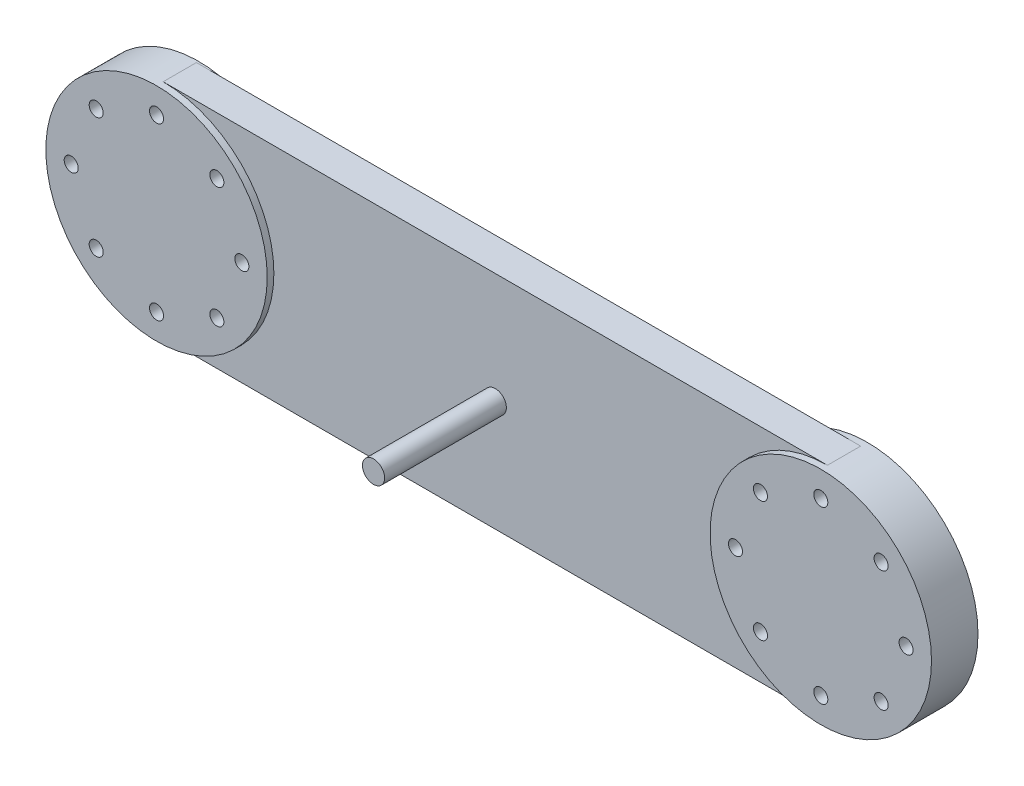
ISO-10303-21;
HEADER;
FILE_DESCRIPTION(('STEP AP214'),'2;1');
FILE_NAME('part.step','',(''),(''),'','','');
FILE_SCHEMA(('AUTOMOTIVE_DESIGN { 1 0 10303 214 1 1 1 1 }'));
ENDSEC;
DATA;
#1=APPLICATION_CONTEXT('core data for automotive mechanical design processes');
#2=APPLICATION_PROTOCOL_DEFINITION('international standard','automotive_design',2000,#1);
#3=PRODUCT_CONTEXT('',#1,'mechanical');
#4=PRODUCT('Part','Part','',(#3));
#5=PRODUCT_RELATED_PRODUCT_CATEGORY('part','',(#4));
#6=PRODUCT_DEFINITION_FORMATION('','',#4);
#7=PRODUCT_DEFINITION_CONTEXT('part definition',#1,'design');
#8=PRODUCT_DEFINITION('design','',#6,#7);
#9=PRODUCT_DEFINITION_SHAPE('','',#8);
#10=(LENGTH_UNIT() NAMED_UNIT(*) SI_UNIT(.MILLI.,.METRE.));
#11=(NAMED_UNIT(*) PLANE_ANGLE_UNIT() SI_UNIT($,.RADIAN.));
#12=(NAMED_UNIT(*) SI_UNIT($,.STERADIAN.) SOLID_ANGLE_UNIT());
#13=UNCERTAINTY_MEASURE_WITH_UNIT(LENGTH_MEASURE(1.E-05),#10,'distance_accuracy_value','');
#14=(GEOMETRIC_REPRESENTATION_CONTEXT(3) GLOBAL_UNCERTAINTY_ASSIGNED_CONTEXT((#13)) GLOBAL_UNIT_ASSIGNED_CONTEXT((#10,
#11,#12)) REPRESENTATION_CONTEXT('',''));
#15=CARTESIAN_POINT('',(0.,0.,0.));
#16=DIRECTION('',(0.,0.,1.));
#17=DIRECTION('',(1.,0.,0.));
#18=AXIS2_PLACEMENT_3D('',#15,#16,#17);
#19=CARTESIAN_POINT('',(-300.,50.,0.));
#20=DIRECTION('',(0.,0.,1.));
#21=DIRECTION('',(1.,0.,0.));
#22=AXIS2_PLACEMENT_3D('',#19,#20,#21);
#23=PLANE('',#22);
#24=CARTESIAN_POINT('',(0.,50.,0.));
#25=DIRECTION('',(0.,0.,1.));
#26=DIRECTION('',(1.,0.,0.));
#27=AXIS2_PLACEMENT_3D('',#24,#25,#26);
#28=CIRCLE('',#27,50.);
#29=CARTESIAN_POINT('',(0.,100.,0.));
#30=VERTEX_POINT('',#29);
#31=CARTESIAN_POINT('',(0.,0.,0.));
#32=VERTEX_POINT('',#31);
#33=EDGE_CURVE('E138',#30,#32,#28,.T.);
#34=ORIENTED_EDGE('',*,*,#33,.T.);
#35=DIRECTION('',(-1.,0.,0.));
#36=VECTOR('',#35,1.);
#37=CARTESIAN_POINT('',(0.,0.,0.));
#38=LINE('',#37,#36);
#39=CARTESIAN_POINT('',(-300.,0.,0.));
#40=VERTEX_POINT('',#39);
#41=EDGE_CURVE('E146',#32,#40,#38,.T.);
#42=ORIENTED_EDGE('',*,*,#41,.T.);
#43=CARTESIAN_POINT('',(-300.,50.,0.));
#44=DIRECTION('',(0.,0.,1.));
#45=DIRECTION('',(1.,0.,0.));
#46=AXIS2_PLACEMENT_3D('',#43,#44,#45);
#47=CIRCLE('',#46,50.);
#48=CARTESIAN_POINT('',(-300.,100.,0.));
#49=VERTEX_POINT('',#48);
#50=EDGE_CURVE('E285',#40,#49,#47,.T.);
#51=ORIENTED_EDGE('',*,*,#50,.T.);
#52=DIRECTION('',(-1.,0.,0.));
#53=VECTOR('',#52,1.);
#54=CARTESIAN_POINT('',(0.,100.,0.));
#55=LINE('',#54,#53);
#56=EDGE_CURVE('E157',#30,#49,#55,.T.);
#57=ORIENTED_EDGE('',*,*,#56,.F.);
#58=EDGE_LOOP('',(#34,#42,#51,#57));
#59=FACE_BOUND('',#58,.T.);
#60=ADVANCED_FACE('F89',(#59),#23,.F.);
#61=CARTESIAN_POINT('',(0.,100.,15.));
#62=DIRECTION('',(0.,-1.,0.));
#63=DIRECTION('',(1.,0.,0.));
#64=AXIS2_PLACEMENT_3D('',#61,#62,#63);
#65=PLANE('',#64);
#66=ORIENTED_EDGE('',*,*,#56,.T.);
#67=DIRECTION('',(0.,0.,-1.));
#68=VECTOR('',#67,1.);
#69=CARTESIAN_POINT('',(-300.,100.,15.));
#70=LINE('',#69,#68);
#71=CARTESIAN_POINT('',(-300.,100.,15.));
#72=VERTEX_POINT('',#71);
#73=EDGE_CURVE('E166',#72,#49,#70,.T.);
#74=ORIENTED_EDGE('',*,*,#73,.F.);
#75=DIRECTION('',(-1.,0.,0.));
#76=VECTOR('',#75,1.);
#77=CARTESIAN_POINT('',(0.,100.,15.));
#78=LINE('',#77,#76);
#79=CARTESIAN_POINT('',(0.,100.,15.));
#80=VERTEX_POINT('',#79);
#81=EDGE_CURVE('E151',#80,#72,#78,.T.);
#82=ORIENTED_EDGE('',*,*,#81,.F.);
#83=DIRECTION('',(0.,0.,-1.));
#84=VECTOR('',#83,1.);
#85=CARTESIAN_POINT('',(0.,100.,15.));
#86=LINE('',#85,#84);
#87=EDGE_CURVE('E98',#80,#30,#86,.T.);
#88=ORIENTED_EDGE('',*,*,#87,.T.);
#89=EDGE_LOOP('',(#66,#74,#82,#88));
#90=FACE_BOUND('',#89,.T.);
#91=ADVANCED_FACE('F308',(#90),#65,.F.);
#92=CARTESIAN_POINT('',(0.,0.,15.));
#93=DIRECTION('',(0.,-1.,0.));
#94=DIRECTION('',(1.,0.,0.));
#95=AXIS2_PLACEMENT_3D('',#92,#93,#94);
#96=PLANE('',#95);
#97=ORIENTED_EDGE('',*,*,#41,.F.);
#98=DIRECTION('',(0.,0.,-1.));
#99=VECTOR('',#98,1.);
#100=CARTESIAN_POINT('',(0.,0.,15.));
#101=LINE('',#100,#99);
#102=CARTESIAN_POINT('',(0.,0.,15.));
#103=VERTEX_POINT('',#102);
#104=EDGE_CURVE('E130',#103,#32,#101,.T.);
#105=ORIENTED_EDGE('',*,*,#104,.F.);
#106=DIRECTION('',(-1.,0.,0.));
#107=VECTOR('',#106,1.);
#108=CARTESIAN_POINT('',(0.,0.,15.));
#109=LINE('',#108,#107);
#110=CARTESIAN_POINT('',(-300.,0.,15.));
#111=VERTEX_POINT('',#110);
#112=EDGE_CURVE('E144',#103,#111,#109,.T.);
#113=ORIENTED_EDGE('',*,*,#112,.T.);
#114=DIRECTION('',(0.,0.,-1.));
#115=VECTOR('',#114,1.);
#116=CARTESIAN_POINT('',(-300.,0.,15.));
#117=LINE('',#116,#115);
#118=EDGE_CURVE('E106',#111,#40,#117,.T.);
#119=ORIENTED_EDGE('',*,*,#118,.T.);
#120=EDGE_LOOP('',(#97,#105,#113,#119));
#121=FACE_BOUND('',#120,.T.);
#122=ADVANCED_FACE('F143',(#121),#96,.T.);
#123=CARTESIAN_POINT('',(0.,0.,15.));
#124=DIRECTION('',(0.,0.,1.));
#125=DIRECTION('',(1.,0.,0.));
#126=AXIS2_PLACEMENT_3D('',#123,#124,#125);
#127=PLANE('',#126);
#128=CARTESIAN_POINT('',(-150.,49.9999999999999,15.));
#129=DIRECTION('',(0.,0.,1.));
#130=DIRECTION('',(1.,0.,0.));
#131=AXIS2_PLACEMENT_3D('',#128,#129,#130);
#132=CIRCLE('',#131,4.99999999999999);
#133=CARTESIAN_POINT('',(-145.,49.9999999999999,15.));
#134=VERTEX_POINT('',#133);
#135=EDGE_CURVE('E161',#134,#134,#132,.F.);
#136=ORIENTED_EDGE('',*,*,#135,.T.);
#137=EDGE_LOOP('',(#136));
#138=FACE_BOUND('',#137,.T.);
#139=ORIENTED_EDGE('',*,*,#112,.F.);
#140=CARTESIAN_POINT('',(0.,50.,15.));
#141=DIRECTION('',(0.,0.,1.));
#142=DIRECTION('',(1.,0.,0.));
#143=AXIS2_PLACEMENT_3D('',#140,#141,#142);
#144=CIRCLE('',#143,50.);
#145=EDGE_CURVE('E127',#103,#80,#144,.F.);
#146=ORIENTED_EDGE('',*,*,#145,.T.);
#147=ORIENTED_EDGE('',*,*,#81,.T.);
#148=CARTESIAN_POINT('',(-300.,50.,15.));
#149=DIRECTION('',(0.,0.,1.));
#150=DIRECTION('',(1.,0.,0.));
#151=AXIS2_PLACEMENT_3D('',#148,#149,#150);
#152=CIRCLE('',#151,50.);
#153=EDGE_CURVE('E12',#72,#111,#152,.F.);
#154=ORIENTED_EDGE('',*,*,#153,.T.);
#155=EDGE_LOOP('',(#139,#146,#147,#154));
#156=FACE_BOUND('',#155,.T.);
#157=ADVANCED_FACE('F149',(#138,#156),#127,.T.);
#158=CARTESIAN_POINT('',(-150.,49.9999999999999,70.));
#159=DIRECTION('',(0.,0.,-1.));
#160=DIRECTION('',(-1.,0.,0.));
#161=AXIS2_PLACEMENT_3D('',#158,#159,#160);
#162=CYLINDRICAL_SURFACE('',#161,4.99999999999999);
#163=ORIENTED_EDGE('',*,*,#135,.F.);
#164=EDGE_LOOP('',(#163));
#165=FACE_BOUND('',#164,.T.);
#166=CARTESIAN_POINT('',(-150.,49.9999999999999,70.));
#167=DIRECTION('',(0.,0.,1.));
#168=DIRECTION('',(1.,0.,0.));
#169=AXIS2_PLACEMENT_3D('',#166,#167,#168);
#170=CIRCLE('',#169,4.99999999999999);
#171=CARTESIAN_POINT('',(-145.,49.9999999999999,70.));
#172=VERTEX_POINT('',#171);
#173=EDGE_CURVE('E173',#172,#172,#170,.T.);
#174=ORIENTED_EDGE('',*,*,#173,.F.);
#175=EDGE_LOOP('',(#174));
#176=FACE_BOUND('',#175,.T.);
#177=ADVANCED_FACE('F294',(#165,#176),#162,.T.);
#178=CARTESIAN_POINT('',(-150.,49.9999999999999,70.));
#179=DIRECTION('',(0.,0.,1.));
#180=DIRECTION('',(1.,0.,0.));
#181=AXIS2_PLACEMENT_3D('',#178,#179,#180);
#182=PLANE('',#181);
#183=ORIENTED_EDGE('',*,*,#173,.T.);
#184=EDGE_LOOP('',(#183));
#185=FACE_BOUND('',#184,.T.);
#186=ADVANCED_FACE('F292',(#185),#182,.T.);
#187=CARTESIAN_POINT('',(-300.,50.,-0.999999999999997));
#188=DIRECTION('',(0.,0.,1.));
#189=DIRECTION('',(1.,0.,0.));
#190=AXIS2_PLACEMENT_3D('',#187,#188,#189);
#191=CYLINDRICAL_SURFACE('',#190,50.);
#192=CARTESIAN_POINT('',(-300.,50.,18.));
#193=DIRECTION('',(0.,0.,1.));
#194=DIRECTION('',(1.,0.,0.));
#195=AXIS2_PLACEMENT_3D('',#192,#193,#194);
#196=CIRCLE('',#195,50.);
#197=CARTESIAN_POINT('',(-250.,50.,18.));
#198=VERTEX_POINT('',#197);
#199=EDGE_CURVE('E277',#198,#198,#196,.T.);
#200=ORIENTED_EDGE('',*,*,#199,.F.);
#201=EDGE_LOOP('',(#200));
#202=FACE_BOUND('',#201,.T.);
#203=CARTESIAN_POINT('',(-300.,50.,-0.999999999999997));
#204=DIRECTION('',(0.,0.,1.));
#205=DIRECTION('',(1.,0.,0.));
#206=AXIS2_PLACEMENT_3D('',#203,#204,#205);
#207=CIRCLE('',#206,50.);
#208=CARTESIAN_POINT('',(-250.,50.,-0.999999999999997));
#209=VERTEX_POINT('',#208);
#210=EDGE_CURVE('E281',#209,#209,#207,.T.);
#211=ORIENTED_EDGE('',*,*,#210,.T.);
#212=EDGE_LOOP('',(#211));
#213=FACE_BOUND('',#212,.T.);
#214=ORIENTED_EDGE('',*,*,#50,.F.);
#215=ORIENTED_EDGE('',*,*,#118,.F.);
#216=ORIENTED_EDGE('',*,*,#153,.F.);
#217=ORIENTED_EDGE('',*,*,#73,.T.);
#218=EDGE_LOOP('',(#214,#215,#216,#217));
#219=FACE_BOUND('',#218,.T.);
#220=ADVANCED_FACE('F302',(#202,#213,#219),#191,.T.);
#221=CARTESIAN_POINT('',(-300.,50.,-0.999999999999997));
#222=DIRECTION('',(0.,0.,1.));
#223=DIRECTION('',(1.,0.,0.));
#224=AXIS2_PLACEMENT_3D('',#221,#222,#223);
#225=PLANE('',#224);
#226=CARTESIAN_POINT('',(-272.754935969733,22.7549359697327,-1.));
#227=DIRECTION('',(0.,0.,1.));
#228=DIRECTION('',(1.,0.,0.));
#229=AXIS2_PLACEMENT_3D('',#226,#227,#228);
#230=CIRCLE('',#229,3.17499999999995);
#231=CARTESIAN_POINT('',(-269.579935969733,22.7549359697327,-1.));
#232=VERTEX_POINT('',#231);
#233=EDGE_CURVE('E260',#232,#232,#230,.T.);
#234=ORIENTED_EDGE('',*,*,#233,.T.);
#235=EDGE_LOOP('',(#234));
#236=FACE_BOUND('',#235,.T.);
#237=CARTESIAN_POINT('',(-300.,11.4696609406727,-1.));
#238=DIRECTION('',(0.,0.,1.));
#239=DIRECTION('',(1.,0.,0.));
#240=AXIS2_PLACEMENT_3D('',#237,#238,#239);
#241=CIRCLE('',#240,3.17499999999997);
#242=CARTESIAN_POINT('',(-296.825,11.4696609406727,-1.));
#243=VERTEX_POINT('',#242);
#244=EDGE_CURVE('E246',#243,#243,#241,.T.);
#245=ORIENTED_EDGE('',*,*,#244,.T.);
#246=EDGE_LOOP('',(#245));
#247=FACE_BOUND('',#246,.T.);
#248=CARTESIAN_POINT('',(-327.245064030267,22.7549359697329,-1.));
#249=DIRECTION('',(0.,0.,1.));
#250=DIRECTION('',(1.,0.,0.));
#251=AXIS2_PLACEMENT_3D('',#248,#249,#250);
#252=CIRCLE('',#251,3.17499999999995);
#253=CARTESIAN_POINT('',(-324.070064030267,22.7549359697329,-1.));
#254=VERTEX_POINT('',#253);
#255=EDGE_CURVE('E242',#254,#254,#252,.T.);
#256=ORIENTED_EDGE('',*,*,#255,.T.);
#257=EDGE_LOOP('',(#256));
#258=FACE_BOUND('',#257,.T.);
#259=CARTESIAN_POINT('',(-338.530339059327,50.0000000000003,-1.));
#260=DIRECTION('',(0.,0.,1.));
#261=DIRECTION('',(1.,0.,0.));
#262=AXIS2_PLACEMENT_3D('',#259,#260,#261);
#263=CIRCLE('',#262,3.17499999999996);
#264=CARTESIAN_POINT('',(-335.355339059327,50.0000000000003,-1.));
#265=VERTEX_POINT('',#264);
#266=EDGE_CURVE('E238',#265,#265,#263,.T.);
#267=ORIENTED_EDGE('',*,*,#266,.T.);
#268=EDGE_LOOP('',(#267));
#269=FACE_BOUND('',#268,.T.);
#270=CARTESIAN_POINT('',(-327.245064030267,77.2450640302675,-1.));
#271=DIRECTION('',(0.,0.,1.));
#272=DIRECTION('',(1.,0.,0.));
#273=AXIS2_PLACEMENT_3D('',#270,#271,#272);
#274=CIRCLE('',#273,3.17499999999997);
#275=CARTESIAN_POINT('',(-324.070064030267,77.2450640302675,-1.));
#276=VERTEX_POINT('',#275);
#277=EDGE_CURVE('E233',#276,#276,#274,.T.);
#278=ORIENTED_EDGE('',*,*,#277,.T.);
#279=EDGE_LOOP('',(#278));
#280=FACE_BOUND('',#279,.T.);
#281=CARTESIAN_POINT('',(-300.,88.5303390593272,-1.));
#282=DIRECTION('',(0.,0.,1.));
#283=DIRECTION('',(1.,0.,0.));
#284=AXIS2_PLACEMENT_3D('',#281,#282,#283);
#285=CIRCLE('',#284,3.17500000000002);
#286=CARTESIAN_POINT('',(-296.825,88.5303390593272,-1.));
#287=VERTEX_POINT('',#286);
#288=EDGE_CURVE('E228',#287,#287,#285,.T.);
#289=ORIENTED_EDGE('',*,*,#288,.T.);
#290=EDGE_LOOP('',(#289));
#291=FACE_BOUND('',#290,.T.);
#292=CARTESIAN_POINT('',(-272.754935969732,77.2450640302669,-1.));
#293=DIRECTION('',(0.,0.,1.));
#294=DIRECTION('',(1.,0.,0.));
#295=AXIS2_PLACEMENT_3D('',#292,#293,#294);
#296=CIRCLE('',#295,3.17499999999998);
#297=CARTESIAN_POINT('',(-269.579935969732,77.2450640302669,-1.));
#298=VERTEX_POINT('',#297);
#299=EDGE_CURVE('E223',#298,#298,#296,.T.);
#300=ORIENTED_EDGE('',*,*,#299,.T.);
#301=EDGE_LOOP('',(#300));
#302=FACE_BOUND('',#301,.T.);
#303=CARTESIAN_POINT('',(-261.469660940673,50.,-1.));
#304=DIRECTION('',(0.,0.,1.));
#305=DIRECTION('',(1.,0.,0.));
#306=AXIS2_PLACEMENT_3D('',#303,#304,#305);
#307=CIRCLE('',#306,3.17499999999997);
#308=CARTESIAN_POINT('',(-258.294660940673,50.,-1.));
#309=VERTEX_POINT('',#308);
#310=EDGE_CURVE('E178',#309,#309,#307,.F.);
#311=ORIENTED_EDGE('',*,*,#310,.F.);
#312=EDGE_LOOP('',(#311));
#313=FACE_BOUND('',#312,.T.);
#314=ORIENTED_EDGE('',*,*,#210,.F.);
#315=EDGE_LOOP('',(#314));
#316=FACE_BOUND('',#315,.T.);
#317=ADVANCED_FACE('F317',(#236,#247,#258,#269,#280,#291,#302,#313,#316),#225,.F.);
#318=CARTESIAN_POINT('',(-300.,50.,18.));
#319=DIRECTION('',(0.,0.,1.));
#320=DIRECTION('',(1.,0.,0.));
#321=AXIS2_PLACEMENT_3D('',#318,#319,#320);
#322=PLANE('',#321);
#323=CARTESIAN_POINT('',(-272.754935969733,22.7549359697327,18.));
#324=DIRECTION('',(0.,0.,1.));
#325=DIRECTION('',(1.,0.,0.));
#326=AXIS2_PLACEMENT_3D('',#323,#324,#325);
#327=CIRCLE('',#326,3.17499999999995);
#328=CARTESIAN_POINT('',(-269.579935969733,22.7549359697327,18.));
#329=VERTEX_POINT('',#328);
#330=EDGE_CURVE('E92',#329,#329,#327,.T.);
#331=ORIENTED_EDGE('',*,*,#330,.F.);
#332=EDGE_LOOP('',(#331));
#333=FACE_BOUND('',#332,.T.);
#334=CARTESIAN_POINT('',(-300.,11.4696609406727,18.));
#335=DIRECTION('',(0.,0.,1.));
#336=DIRECTION('',(1.,0.,0.));
#337=AXIS2_PLACEMENT_3D('',#334,#335,#336);
#338=CIRCLE('',#337,3.17499999999997);
#339=CARTESIAN_POINT('',(-296.825,11.4696609406727,18.));
#340=VERTEX_POINT('',#339);
#341=EDGE_CURVE('E243',#340,#340,#338,.T.);
#342=ORIENTED_EDGE('',*,*,#341,.F.);
#343=EDGE_LOOP('',(#342));
#344=FACE_BOUND('',#343,.T.);
#345=CARTESIAN_POINT('',(-327.245064030267,22.7549359697329,18.));
#346=DIRECTION('',(0.,0.,1.));
#347=DIRECTION('',(1.,0.,0.));
#348=AXIS2_PLACEMENT_3D('',#345,#346,#347);
#349=CIRCLE('',#348,3.17499999999995);
#350=CARTESIAN_POINT('',(-324.070064030267,22.7549359697329,18.));
#351=VERTEX_POINT('',#350);
#352=EDGE_CURVE('E239',#351,#351,#349,.T.);
#353=ORIENTED_EDGE('',*,*,#352,.F.);
#354=EDGE_LOOP('',(#353));
#355=FACE_BOUND('',#354,.T.);
#356=CARTESIAN_POINT('',(-338.530339059327,50.0000000000003,18.));
#357=DIRECTION('',(0.,0.,1.));
#358=DIRECTION('',(1.,0.,0.));
#359=AXIS2_PLACEMENT_3D('',#356,#357,#358);
#360=CIRCLE('',#359,3.17499999999996);
#361=CARTESIAN_POINT('',(-335.355339059327,50.0000000000003,18.));
#362=VERTEX_POINT('',#361);
#363=EDGE_CURVE('E234',#362,#362,#360,.T.);
#364=ORIENTED_EDGE('',*,*,#363,.F.);
#365=EDGE_LOOP('',(#364));
#366=FACE_BOUND('',#365,.T.);
#367=CARTESIAN_POINT('',(-327.245064030267,77.2450640302675,18.));
#368=DIRECTION('',(0.,0.,1.));
#369=DIRECTION('',(1.,0.,0.));
#370=AXIS2_PLACEMENT_3D('',#367,#368,#369);
#371=CIRCLE('',#370,3.17499999999997);
#372=CARTESIAN_POINT('',(-324.070064030267,77.2450640302675,18.));
#373=VERTEX_POINT('',#372);
#374=EDGE_CURVE('E229',#373,#373,#371,.T.);
#375=ORIENTED_EDGE('',*,*,#374,.F.);
#376=EDGE_LOOP('',(#375));
#377=FACE_BOUND('',#376,.T.);
#378=CARTESIAN_POINT('',(-300.,88.5303390593272,18.));
#379=DIRECTION('',(0.,0.,1.));
#380=DIRECTION('',(1.,0.,0.));
#381=AXIS2_PLACEMENT_3D('',#378,#379,#380);
#382=CIRCLE('',#381,3.17500000000002);
#383=CARTESIAN_POINT('',(-296.825,88.5303390593272,18.));
#384=VERTEX_POINT('',#383);
#385=EDGE_CURVE('E224',#384,#384,#382,.T.);
#386=ORIENTED_EDGE('',*,*,#385,.F.);
#387=EDGE_LOOP('',(#386));
#388=FACE_BOUND('',#387,.T.);
#389=CARTESIAN_POINT('',(-272.754935969732,77.2450640302669,18.));
#390=DIRECTION('',(0.,0.,1.));
#391=DIRECTION('',(1.,0.,0.));
#392=AXIS2_PLACEMENT_3D('',#389,#390,#391);
#393=CIRCLE('',#392,3.17499999999998);
#394=CARTESIAN_POINT('',(-269.579935969732,77.2450640302669,18.));
#395=VERTEX_POINT('',#394);
#396=EDGE_CURVE('E219',#395,#395,#393,.T.);
#397=ORIENTED_EDGE('',*,*,#396,.F.);
#398=EDGE_LOOP('',(#397));
#399=FACE_BOUND('',#398,.T.);
#400=CARTESIAN_POINT('',(-261.469660940673,50.,18.));
#401=DIRECTION('',(0.,0.,1.));
#402=DIRECTION('',(1.,0.,0.));
#403=AXIS2_PLACEMENT_3D('',#400,#401,#402);
#404=CIRCLE('',#403,3.17499999999997);
#405=CARTESIAN_POINT('',(-258.294660940673,50.,18.));
#406=VERTEX_POINT('',#405);
#407=EDGE_CURVE('E137',#406,#406,#404,.F.);
#408=ORIENTED_EDGE('',*,*,#407,.T.);
#409=EDGE_LOOP('',(#408));
#410=FACE_BOUND('',#409,.T.);
#411=ORIENTED_EDGE('',*,*,#199,.T.);
#412=EDGE_LOOP('',(#411));
#413=FACE_BOUND('',#412,.T.);
#414=ADVANCED_FACE('F323',(#333,#344,#355,#366,#377,#388,#399,#410,#413),#322,.T.);
#415=CARTESIAN_POINT('',(-261.469660940673,50.,130.));
#416=DIRECTION('',(0.,0.,-1.));
#417=DIRECTION('',(-1.,0.,0.));
#418=AXIS2_PLACEMENT_3D('',#415,#416,#417);
#419=CYLINDRICAL_SURFACE('',#418,3.17499999999997);
#420=ORIENTED_EDGE('',*,*,#407,.F.);
#421=EDGE_LOOP('',(#420));
#422=FACE_BOUND('',#421,.T.);
#423=ORIENTED_EDGE('',*,*,#310,.T.);
#424=EDGE_LOOP('',(#423));
#425=FACE_BOUND('',#424,.T.);
#426=ADVANCED_FACE('F331',(#422,#425),#419,.F.);
#427=CARTESIAN_POINT('',(0.,50.,18.));
#428=DIRECTION('',(0.,0.,-1.));
#429=DIRECTION('',(-1.,0.,0.));
#430=AXIS2_PLACEMENT_3D('',#427,#428,#429);
#431=CYLINDRICAL_SURFACE('',#430,50.);
#432=CARTESIAN_POINT('',(0.,50.,18.));
#433=DIRECTION('',(0.,0.,1.));
#434=DIRECTION('',(1.,0.,0.));
#435=AXIS2_PLACEMENT_3D('',#432,#433,#434);
#436=CIRCLE('',#435,50.);
#437=CARTESIAN_POINT('',(50.,50.,18.));
#438=VERTEX_POINT('',#437);
#439=EDGE_CURVE('E268',#438,#438,#436,.T.);
#440=ORIENTED_EDGE('',*,*,#439,.F.);
#441=EDGE_LOOP('',(#440));
#442=FACE_BOUND('',#441,.T.);
#443=CARTESIAN_POINT('',(0.,50.,-3.));
#444=DIRECTION('',(0.,0.,1.));
#445=DIRECTION('',(1.,0.,0.));
#446=AXIS2_PLACEMENT_3D('',#443,#444,#445);
#447=CIRCLE('',#446,50.);
#448=CARTESIAN_POINT('',(50.,50.,-3.));
#449=VERTEX_POINT('',#448);
#450=EDGE_CURVE('E264',#449,#449,#447,.T.);
#451=ORIENTED_EDGE('',*,*,#450,.T.);
#452=EDGE_LOOP('',(#451));
#453=FACE_BOUND('',#452,.T.);
#454=ORIENTED_EDGE('',*,*,#104,.T.);
#455=ORIENTED_EDGE('',*,*,#33,.F.);
#456=ORIENTED_EDGE('',*,*,#87,.F.);
#457=ORIENTED_EDGE('',*,*,#145,.F.);
#458=EDGE_LOOP('',(#454,#455,#456,#457));
#459=FACE_BOUND('',#458,.T.);
#460=ADVANCED_FACE('F129',(#442,#453,#459),#431,.T.);
#461=CARTESIAN_POINT('',(0.,50.,18.));
#462=DIRECTION('',(0.,0.,1.));
#463=DIRECTION('',(1.,0.,0.));
#464=AXIS2_PLACEMENT_3D('',#461,#462,#463);
#465=PLANE('',#464);
#466=CARTESIAN_POINT('',(-27.2450640302676,22.754935969733,18.));
#467=DIRECTION('',(0.,0.,1.));
#468=DIRECTION('',(1.,0.,0.));
#469=AXIS2_PLACEMENT_3D('',#466,#467,#468);
#470=CIRCLE('',#469,3.17500000000001);
#471=CARTESIAN_POINT('',(-24.0700640302676,22.754935969733,18.));
#472=VERTEX_POINT('',#471);
#473=EDGE_CURVE('E218',#472,#472,#470,.F.);
#474=ORIENTED_EDGE('',*,*,#473,.T.);
#475=EDGE_LOOP('',(#474));
#476=FACE_BOUND('',#475,.T.);
#477=CARTESIAN_POINT('',(-3.7470027081099E-13,11.4696609406726,18.));
#478=DIRECTION('',(0.,0.,1.));
#479=DIRECTION('',(1.,0.,0.));
#480=AXIS2_PLACEMENT_3D('',#477,#478,#479);
#481=CIRCLE('',#480,3.175);
#482=CARTESIAN_POINT('',(3.17499999999962,11.4696609406726,18.));
#483=VERTEX_POINT('',#482);
#484=EDGE_CURVE('E213',#483,#483,#481,.F.);
#485=ORIENTED_EDGE('',*,*,#484,.T.);
#486=EDGE_LOOP('',(#485));
#487=FACE_BOUND('',#486,.T.);
#488=CARTESIAN_POINT('',(38.5303390593274,49.9999999999998,18.));
#489=DIRECTION('',(0.,0.,1.));
#490=DIRECTION('',(1.,0.,0.));
#491=AXIS2_PLACEMENT_3D('',#488,#489,#490);
#492=CIRCLE('',#491,3.175);
#493=CARTESIAN_POINT('',(41.7053390593274,49.9999999999998,18.));
#494=VERTEX_POINT('',#493);
#495=EDGE_CURVE('E208',#494,#494,#492,.F.);
#496=ORIENTED_EDGE('',*,*,#495,.T.);
#497=EDGE_LOOP('',(#496));
#498=FACE_BOUND('',#497,.T.);
#499=CARTESIAN_POINT('',(27.2450640302671,22.7549359697325,18.));
#500=DIRECTION('',(0.,0.,1.));
#501=DIRECTION('',(1.,0.,0.));
#502=AXIS2_PLACEMENT_3D('',#499,#500,#501);
#503=CIRCLE('',#502,3.175);
#504=CARTESIAN_POINT('',(30.4200640302671,22.7549359697325,18.));
#505=VERTEX_POINT('',#504);
#506=EDGE_CURVE('E203',#505,#505,#503,.F.);
#507=ORIENTED_EDGE('',*,*,#506,.T.);
#508=EDGE_LOOP('',(#507));
#509=FACE_BOUND('',#508,.T.);
#510=CARTESIAN_POINT('',(27.2450640302674,77.2450640302672,18.));
#511=DIRECTION('',(0.,0.,1.));
#512=DIRECTION('',(1.,0.,0.));
#513=AXIS2_PLACEMENT_3D('',#510,#511,#512);
#514=CIRCLE('',#513,3.175);
#515=CARTESIAN_POINT('',(30.4200640302674,77.2450640302672,18.));
#516=VERTEX_POINT('',#515);
#517=EDGE_CURVE('E198',#516,#516,#514,.F.);
#518=ORIENTED_EDGE('',*,*,#517,.T.);
#519=EDGE_LOOP('',(#518));
#520=FACE_BOUND('',#519,.T.);
#521=CARTESIAN_POINT('',(0.,88.5303390593274,18.));
#522=DIRECTION('',(0.,0.,1.));
#523=DIRECTION('',(1.,0.,0.));
#524=AXIS2_PLACEMENT_3D('',#521,#522,#523);
#525=CIRCLE('',#524,3.17499999999999);
#526=CARTESIAN_POINT('',(3.17500000000009,88.5303390593274,18.));
#527=VERTEX_POINT('',#526);
#528=EDGE_CURVE('E193',#527,#527,#525,.F.);
#529=ORIENTED_EDGE('',*,*,#528,.T.);
#530=EDGE_LOOP('',(#529));
#531=FACE_BOUND('',#530,.T.);
#532=CARTESIAN_POINT('',(-27.2450640302676,77.2450640302669,18.));
#533=DIRECTION('',(0.,0.,1.));
#534=DIRECTION('',(1.,0.,0.));
#535=AXIS2_PLACEMENT_3D('',#532,#533,#534);
#536=CIRCLE('',#535,3.17499999999998);
#537=CARTESIAN_POINT('',(-24.0700640302676,77.2450640302669,18.));
#538=VERTEX_POINT('',#537);
#539=EDGE_CURVE('E188',#538,#538,#536,.F.);
#540=ORIENTED_EDGE('',*,*,#539,.T.);
#541=EDGE_LOOP('',(#540));
#542=FACE_BOUND('',#541,.T.);
#543=CARTESIAN_POINT('',(-38.5303390593274,50.,18.));
#544=DIRECTION('',(0.,0.,1.));
#545=DIRECTION('',(1.,0.,0.));
#546=AXIS2_PLACEMENT_3D('',#543,#544,#545);
#547=CIRCLE('',#546,3.175);
#548=CARTESIAN_POINT('',(-35.3553390593274,50.,18.));
#549=VERTEX_POINT('',#548);
#550=EDGE_CURVE('E183',#549,#549,#547,.F.);
#551=ORIENTED_EDGE('',*,*,#550,.T.);
#552=EDGE_LOOP('',(#551));
#553=FACE_BOUND('',#552,.T.);
#554=ORIENTED_EDGE('',*,*,#439,.T.);
#555=EDGE_LOOP('',(#554));
#556=FACE_BOUND('',#555,.T.);
#557=ADVANCED_FACE('F338',(#476,#487,#498,#509,#520,#531,#542,#553,#556),#465,.T.);
#558=CARTESIAN_POINT('',(0.,50.,-3.));
#559=DIRECTION('',(0.,0.,1.));
#560=DIRECTION('',(1.,0.,0.));
#561=AXIS2_PLACEMENT_3D('',#558,#559,#560);
#562=PLANE('',#561);
#563=CARTESIAN_POINT('',(-27.2450640302676,22.754935969733,-3.));
#564=DIRECTION('',(0.,0.,1.));
#565=DIRECTION('',(1.,0.,0.));
#566=AXIS2_PLACEMENT_3D('',#563,#564,#565);
#567=CIRCLE('',#566,3.17500000000001);
#568=CARTESIAN_POINT('',(-24.0700640302676,22.754935969733,-3.));
#569=VERTEX_POINT('',#568);
#570=EDGE_CURVE('E214',#569,#569,#567,.F.);
#571=ORIENTED_EDGE('',*,*,#570,.F.);
#572=EDGE_LOOP('',(#571));
#573=FACE_BOUND('',#572,.T.);
#574=CARTESIAN_POINT('',(-3.7470027081099E-13,11.4696609406726,-3.));
#575=DIRECTION('',(0.,0.,1.));
#576=DIRECTION('',(1.,0.,0.));
#577=AXIS2_PLACEMENT_3D('',#574,#575,#576);
#578=CIRCLE('',#577,3.175);
#579=CARTESIAN_POINT('',(3.17499999999962,11.4696609406726,-3.));
#580=VERTEX_POINT('',#579);
#581=EDGE_CURVE('E209',#580,#580,#578,.F.);
#582=ORIENTED_EDGE('',*,*,#581,.F.);
#583=EDGE_LOOP('',(#582));
#584=FACE_BOUND('',#583,.T.);
#585=CARTESIAN_POINT('',(38.5303390593274,49.9999999999998,-3.));
#586=DIRECTION('',(0.,0.,1.));
#587=DIRECTION('',(1.,0.,0.));
#588=AXIS2_PLACEMENT_3D('',#585,#586,#587);
#589=CIRCLE('',#588,3.175);
#590=CARTESIAN_POINT('',(41.7053390593274,49.9999999999998,-3.));
#591=VERTEX_POINT('',#590);
#592=EDGE_CURVE('E204',#591,#591,#589,.F.);
#593=ORIENTED_EDGE('',*,*,#592,.F.);
#594=EDGE_LOOP('',(#593));
#595=FACE_BOUND('',#594,.T.);
#596=CARTESIAN_POINT('',(27.2450640302671,22.7549359697325,-3.));
#597=DIRECTION('',(0.,0.,1.));
#598=DIRECTION('',(1.,0.,0.));
#599=AXIS2_PLACEMENT_3D('',#596,#597,#598);
#600=CIRCLE('',#599,3.175);
#601=CARTESIAN_POINT('',(30.4200640302671,22.7549359697325,-3.));
#602=VERTEX_POINT('',#601);
#603=EDGE_CURVE('E199',#602,#602,#600,.F.);
#604=ORIENTED_EDGE('',*,*,#603,.F.);
#605=EDGE_LOOP('',(#604));
#606=FACE_BOUND('',#605,.T.);
#607=CARTESIAN_POINT('',(27.2450640302674,77.2450640302672,-3.));
#608=DIRECTION('',(0.,0.,1.));
#609=DIRECTION('',(1.,0.,0.));
#610=AXIS2_PLACEMENT_3D('',#607,#608,#609);
#611=CIRCLE('',#610,3.175);
#612=CARTESIAN_POINT('',(30.4200640302674,77.2450640302672,-3.));
#613=VERTEX_POINT('',#612);
#614=EDGE_CURVE('E194',#613,#613,#611,.F.);
#615=ORIENTED_EDGE('',*,*,#614,.F.);
#616=EDGE_LOOP('',(#615));
#617=FACE_BOUND('',#616,.T.);
#618=CARTESIAN_POINT('',(0.,88.5303390593274,-3.));
#619=DIRECTION('',(0.,0.,1.));
#620=DIRECTION('',(1.,0.,0.));
#621=AXIS2_PLACEMENT_3D('',#618,#619,#620);
#622=CIRCLE('',#621,3.17499999999999);
#623=CARTESIAN_POINT('',(3.17500000000009,88.5303390593274,-3.));
#624=VERTEX_POINT('',#623);
#625=EDGE_CURVE('E189',#624,#624,#622,.F.);
#626=ORIENTED_EDGE('',*,*,#625,.F.);
#627=EDGE_LOOP('',(#626));
#628=FACE_BOUND('',#627,.T.);
#629=CARTESIAN_POINT('',(-27.2450640302676,77.2450640302669,-3.));
#630=DIRECTION('',(0.,0.,1.));
#631=DIRECTION('',(1.,0.,0.));
#632=AXIS2_PLACEMENT_3D('',#629,#630,#631);
#633=CIRCLE('',#632,3.17499999999998);
#634=CARTESIAN_POINT('',(-24.0700640302676,77.2450640302669,-3.));
#635=VERTEX_POINT('',#634);
#636=EDGE_CURVE('E184',#635,#635,#633,.F.);
#637=ORIENTED_EDGE('',*,*,#636,.F.);
#638=EDGE_LOOP('',(#637));
#639=FACE_BOUND('',#638,.T.);
#640=CARTESIAN_POINT('',(-38.5303390593274,50.,-3.));
#641=DIRECTION('',(0.,0.,1.));
#642=DIRECTION('',(1.,0.,0.));
#643=AXIS2_PLACEMENT_3D('',#640,#641,#642);
#644=CIRCLE('',#643,3.175);
#645=CARTESIAN_POINT('',(-35.3553390593274,50.,-3.));
#646=VERTEX_POINT('',#645);
#647=EDGE_CURVE('E179',#646,#646,#644,.F.);
#648=ORIENTED_EDGE('',*,*,#647,.F.);
#649=EDGE_LOOP('',(#648));
#650=FACE_BOUND('',#649,.T.);
#651=ORIENTED_EDGE('',*,*,#450,.F.);
#652=EDGE_LOOP('',(#651));
#653=FACE_BOUND('',#652,.T.);
#654=ADVANCED_FACE('F342',(#573,#584,#595,#606,#617,#628,#639,#650,#653),#562,.F.);
#655=CARTESIAN_POINT('',(-38.5303390593274,50.,-98.));
#656=DIRECTION('',(0.,0.,1.));
#657=DIRECTION('',(1.,0.,0.));
#658=AXIS2_PLACEMENT_3D('',#655,#656,#657);
#659=CYLINDRICAL_SURFACE('',#658,3.175);
#660=ORIENTED_EDGE('',*,*,#550,.F.);
#661=EDGE_LOOP('',(#660));
#662=FACE_BOUND('',#661,.T.);
#663=ORIENTED_EDGE('',*,*,#647,.T.);
#664=EDGE_LOOP('',(#663));
#665=FACE_BOUND('',#664,.T.);
#666=ADVANCED_FACE('F346',(#662,#665),#659,.F.);
#667=CARTESIAN_POINT('',(-27.2450640302676,77.2450640302669,-98.));
#668=DIRECTION('',(0.,0.,1.));
#669=DIRECTION('',(1.,0.,0.));
#670=AXIS2_PLACEMENT_3D('',#667,#668,#669);
#671=CYLINDRICAL_SURFACE('',#670,3.17499999999998);
#672=ORIENTED_EDGE('',*,*,#539,.F.);
#673=EDGE_LOOP('',(#672));
#674=FACE_BOUND('',#673,.T.);
#675=ORIENTED_EDGE('',*,*,#636,.T.);
#676=EDGE_LOOP('',(#675));
#677=FACE_BOUND('',#676,.T.);
#678=ADVANCED_FACE('F388',(#674,#677),#671,.F.);
#679=CARTESIAN_POINT('',(0.,88.5303390593274,-98.));
#680=DIRECTION('',(0.,0.,1.));
#681=DIRECTION('',(1.,0.,0.));
#682=AXIS2_PLACEMENT_3D('',#679,#680,#681);
#683=CYLINDRICAL_SURFACE('',#682,3.17499999999999);
#684=ORIENTED_EDGE('',*,*,#528,.F.);
#685=EDGE_LOOP('',(#684));
#686=FACE_BOUND('',#685,.T.);
#687=ORIENTED_EDGE('',*,*,#625,.T.);
#688=EDGE_LOOP('',(#687));
#689=FACE_BOUND('',#688,.T.);
#690=ADVANCED_FACE('F384',(#686,#689),#683,.F.);
#691=CARTESIAN_POINT('',(27.2450640302674,77.2450640302672,-98.));
#692=DIRECTION('',(0.,0.,1.));
#693=DIRECTION('',(1.,0.,0.));
#694=AXIS2_PLACEMENT_3D('',#691,#692,#693);
#695=CYLINDRICAL_SURFACE('',#694,3.175);
#696=ORIENTED_EDGE('',*,*,#517,.F.);
#697=EDGE_LOOP('',(#696));
#698=FACE_BOUND('',#697,.T.);
#699=ORIENTED_EDGE('',*,*,#614,.T.);
#700=EDGE_LOOP('',(#699));
#701=FACE_BOUND('',#700,.T.);
#702=ADVANCED_FACE('F380',(#698,#701),#695,.F.);
#703=CARTESIAN_POINT('',(27.2450640302671,22.7549359697325,-98.));
#704=DIRECTION('',(0.,0.,1.));
#705=DIRECTION('',(1.,0.,0.));
#706=AXIS2_PLACEMENT_3D('',#703,#704,#705);
#707=CYLINDRICAL_SURFACE('',#706,3.175);
#708=ORIENTED_EDGE('',*,*,#506,.F.);
#709=EDGE_LOOP('',(#708));
#710=FACE_BOUND('',#709,.T.);
#711=ORIENTED_EDGE('',*,*,#603,.T.);
#712=EDGE_LOOP('',(#711));
#713=FACE_BOUND('',#712,.T.);
#714=ADVANCED_FACE('F383',(#710,#713),#707,.F.);
#715=CARTESIAN_POINT('',(38.5303390593274,49.9999999999998,-98.));
#716=DIRECTION('',(0.,0.,1.));
#717=DIRECTION('',(1.,0.,0.));
#718=AXIS2_PLACEMENT_3D('',#715,#716,#717);
#719=CYLINDRICAL_SURFACE('',#718,3.175);
#720=ORIENTED_EDGE('',*,*,#495,.F.);
#721=EDGE_LOOP('',(#720));
#722=FACE_BOUND('',#721,.T.);
#723=ORIENTED_EDGE('',*,*,#592,.T.);
#724=EDGE_LOOP('',(#723));
#725=FACE_BOUND('',#724,.T.);
#726=ADVANCED_FACE('F398',(#722,#725),#719,.F.);
#727=CARTESIAN_POINT('',(-3.7470027081099E-13,11.4696609406726,-98.));
#728=DIRECTION('',(0.,0.,1.));
#729=DIRECTION('',(1.,0.,0.));
#730=AXIS2_PLACEMENT_3D('',#727,#728,#729);
#731=CYLINDRICAL_SURFACE('',#730,3.175);
#732=ORIENTED_EDGE('',*,*,#484,.F.);
#733=EDGE_LOOP('',(#732));
#734=FACE_BOUND('',#733,.T.);
#735=ORIENTED_EDGE('',*,*,#581,.T.);
#736=EDGE_LOOP('',(#735));
#737=FACE_BOUND('',#736,.T.);
#738=ADVANCED_FACE('F372',(#734,#737),#731,.F.);
#739=CARTESIAN_POINT('',(-27.2450640302676,22.754935969733,-98.));
#740=DIRECTION('',(0.,0.,1.));
#741=DIRECTION('',(1.,0.,0.));
#742=AXIS2_PLACEMENT_3D('',#739,#740,#741);
#743=CYLINDRICAL_SURFACE('',#742,3.17500000000001);
#744=ORIENTED_EDGE('',*,*,#473,.F.);
#745=EDGE_LOOP('',(#744));
#746=FACE_BOUND('',#745,.T.);
#747=ORIENTED_EDGE('',*,*,#570,.T.);
#748=EDGE_LOOP('',(#747));
#749=FACE_BOUND('',#748,.T.);
#750=ADVANCED_FACE('F352',(#746,#749),#743,.F.);
#751=CARTESIAN_POINT('',(-272.754935969732,77.2450640302669,-98.));
#752=DIRECTION('',(0.,0.,1.));
#753=DIRECTION('',(1.,0.,0.));
#754=AXIS2_PLACEMENT_3D('',#751,#752,#753);
#755=CYLINDRICAL_SURFACE('',#754,3.17499999999998);
#756=ORIENTED_EDGE('',*,*,#396,.T.);
#757=EDGE_LOOP('',(#756));
#758=FACE_BOUND('',#757,.T.);
#759=ORIENTED_EDGE('',*,*,#299,.F.);
#760=EDGE_LOOP('',(#759));
#761=FACE_BOUND('',#760,.T.);
#762=ADVANCED_FACE('F348',(#758,#761),#755,.F.);
#763=CARTESIAN_POINT('',(-300.,88.5303390593272,-98.));
#764=DIRECTION('',(0.,0.,1.));
#765=DIRECTION('',(1.,0.,0.));
#766=AXIS2_PLACEMENT_3D('',#763,#764,#765);
#767=CYLINDRICAL_SURFACE('',#766,3.17500000000002);
#768=ORIENTED_EDGE('',*,*,#385,.T.);
#769=EDGE_LOOP('',(#768));
#770=FACE_BOUND('',#769,.T.);
#771=ORIENTED_EDGE('',*,*,#288,.F.);
#772=EDGE_LOOP('',(#771));
#773=FACE_BOUND('',#772,.T.);
#774=ADVANCED_FACE('F351',(#770,#773),#767,.F.);
#775=CARTESIAN_POINT('',(-327.245064030267,77.2450640302675,-98.));
#776=DIRECTION('',(0.,0.,1.));
#777=DIRECTION('',(1.,0.,0.));
#778=AXIS2_PLACEMENT_3D('',#775,#776,#777);
#779=CYLINDRICAL_SURFACE('',#778,3.17499999999997);
#780=ORIENTED_EDGE('',*,*,#374,.T.);
#781=EDGE_LOOP('',(#780));
#782=FACE_BOUND('',#781,.T.);
#783=ORIENTED_EDGE('',*,*,#277,.F.);
#784=EDGE_LOOP('',(#783));
#785=FACE_BOUND('',#784,.T.);
#786=ADVANCED_FACE('F362',(#782,#785),#779,.F.);
#787=CARTESIAN_POINT('',(-338.530339059327,50.0000000000003,-98.));
#788=DIRECTION('',(0.,0.,1.));
#789=DIRECTION('',(1.,0.,0.));
#790=AXIS2_PLACEMENT_3D('',#787,#788,#789);
#791=CYLINDRICAL_SURFACE('',#790,3.17499999999996);
#792=ORIENTED_EDGE('',*,*,#363,.T.);
#793=EDGE_LOOP('',(#792));
#794=FACE_BOUND('',#793,.T.);
#795=ORIENTED_EDGE('',*,*,#266,.F.);
#796=EDGE_LOOP('',(#795));
#797=FACE_BOUND('',#796,.T.);
#798=ADVANCED_FACE('F358',(#794,#797),#791,.F.);
#799=CARTESIAN_POINT('',(-327.245064030267,22.7549359697329,-98.));
#800=DIRECTION('',(0.,0.,1.));
#801=DIRECTION('',(1.,0.,0.));
#802=AXIS2_PLACEMENT_3D('',#799,#800,#801);
#803=CYLINDRICAL_SURFACE('',#802,3.17499999999995);
#804=ORIENTED_EDGE('',*,*,#352,.T.);
#805=EDGE_LOOP('',(#804));
#806=FACE_BOUND('',#805,.T.);
#807=ORIENTED_EDGE('',*,*,#255,.F.);
#808=EDGE_LOOP('',(#807));
#809=FACE_BOUND('',#808,.T.);
#810=ADVANCED_FACE('F354',(#806,#809),#803,.F.);
#811=CARTESIAN_POINT('',(-300.,11.4696609406727,-98.));
#812=DIRECTION('',(0.,0.,1.));
#813=DIRECTION('',(1.,0.,0.));
#814=AXIS2_PLACEMENT_3D('',#811,#812,#813);
#815=CYLINDRICAL_SURFACE('',#814,3.17499999999997);
#816=ORIENTED_EDGE('',*,*,#341,.T.);
#817=EDGE_LOOP('',(#816));
#818=FACE_BOUND('',#817,.T.);
#819=ORIENTED_EDGE('',*,*,#244,.F.);
#820=EDGE_LOOP('',(#819));
#821=FACE_BOUND('',#820,.T.);
#822=ADVANCED_FACE('F357',(#818,#821),#815,.F.);
#823=CARTESIAN_POINT('',(-272.754935969733,22.7549359697327,-98.));
#824=DIRECTION('',(0.,0.,1.));
#825=DIRECTION('',(1.,0.,0.));
#826=AXIS2_PLACEMENT_3D('',#823,#824,#825);
#827=CYLINDRICAL_SURFACE('',#826,3.17499999999995);
#828=ORIENTED_EDGE('',*,*,#330,.T.);
#829=EDGE_LOOP('',(#828));
#830=FACE_BOUND('',#829,.T.);
#831=ORIENTED_EDGE('',*,*,#233,.F.);
#832=EDGE_LOOP('',(#831));
#833=FACE_BOUND('',#832,.T.);
#834=ADVANCED_FACE('F374',(#830,#833),#827,.F.);
#835=CLOSED_SHELL('',(#60,#91,#122,#157,#177,#186,#220,#317,#414,#426,#460,#557,#654,#666,#678,
#690,#702,#714,#726,#738,#750,#762,#774,#786,#798,#810,#822,#834));
#836=MANIFOLD_SOLID_BREP('B2',#835);
#837=ADVANCED_BREP_SHAPE_REPRESENTATION('',(#18,#836),#14);
#838=SHAPE_DEFINITION_REPRESENTATION(#9,#837);
ENDSEC;
END-ISO-10303-21;
